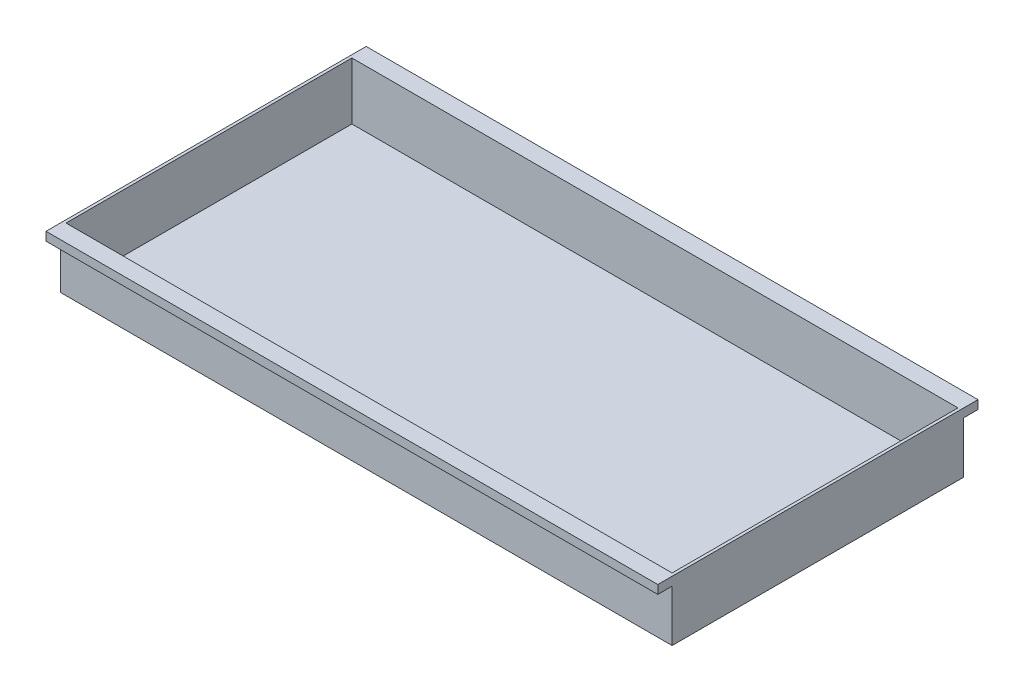
ISO-10303-21;
HEADER;
FILE_DESCRIPTION(('STEP AP214'),'2;1');
FILE_NAME('part.step','',(''),(''),'','','');
FILE_SCHEMA(('AUTOMOTIVE_DESIGN { 1 0 10303 214 1 1 1 1 }'));
ENDSEC;
DATA;
#1=APPLICATION_CONTEXT('core data for automotive mechanical design processes');
#2=APPLICATION_PROTOCOL_DEFINITION('international standard','automotive_design',2000,#1);
#3=PRODUCT_CONTEXT('',#1,'mechanical');
#4=PRODUCT('Part','Part','',(#3));
#5=PRODUCT_RELATED_PRODUCT_CATEGORY('part','',(#4));
#6=PRODUCT_DEFINITION_FORMATION('','',#4);
#7=PRODUCT_DEFINITION_CONTEXT('part definition',#1,'design');
#8=PRODUCT_DEFINITION('design','',#6,#7);
#9=PRODUCT_DEFINITION_SHAPE('','',#8);
#10=(LENGTH_UNIT() NAMED_UNIT(*) SI_UNIT(.MILLI.,.METRE.));
#11=(NAMED_UNIT(*) PLANE_ANGLE_UNIT() SI_UNIT($,.RADIAN.));
#12=(NAMED_UNIT(*) SI_UNIT($,.STERADIAN.) SOLID_ANGLE_UNIT());
#13=UNCERTAINTY_MEASURE_WITH_UNIT(LENGTH_MEASURE(1.E-05),#10,'distance_accuracy_value','');
#14=(GEOMETRIC_REPRESENTATION_CONTEXT(3) GLOBAL_UNCERTAINTY_ASSIGNED_CONTEXT((#13)) GLOBAL_UNIT_ASSIGNED_CONTEXT((#10,
#11,#12)) REPRESENTATION_CONTEXT('',''));
#15=CARTESIAN_POINT('',(0.,0.,0.));
#16=DIRECTION('',(0.,0.,1.));
#17=DIRECTION('',(1.,0.,0.));
#18=AXIS2_PLACEMENT_3D('',#15,#16,#17);
#19=CARTESIAN_POINT('',(535.,-100.,255.));
#20=DIRECTION('',(0.,0.,1.));
#21=DIRECTION('',(1.,0.,0.));
#22=AXIS2_PLACEMENT_3D('',#19,#20,#21);
#23=PLANE('',#22);
#24=DIRECTION('',(0.,1.,0.));
#25=VECTOR('',#24,1.);
#26=CARTESIAN_POINT('',(535.,-100.,255.));
#27=LINE('',#26,#25);
#28=CARTESIAN_POINT('',(535.,-105.,255.));
#29=VERTEX_POINT('',#28);
#30=CARTESIAN_POINT('',(535.,-15.,255.));
#31=VERTEX_POINT('',#30);
#32=EDGE_CURVE('E177',#29,#31,#27,.T.);
#33=ORIENTED_EDGE('',*,*,#32,.T.);
#34=DIRECTION('',(-1.,0.,0.));
#35=VECTOR('',#34,1.);
#36=CARTESIAN_POINT('',(-535.,-15.,255.));
#37=LINE('',#36,#35);
#38=CARTESIAN_POINT('',(-535.,-15.,255.));
#39=VERTEX_POINT('',#38);
#40=EDGE_CURVE('E166',#31,#39,#37,.T.);
#41=ORIENTED_EDGE('',*,*,#40,.T.);
#42=DIRECTION('',(0.,1.,0.));
#43=VECTOR('',#42,1.);
#44=CARTESIAN_POINT('',(-535.,-100.,255.));
#45=LINE('',#44,#43);
#46=CARTESIAN_POINT('',(-535.,-105.,255.));
#47=VERTEX_POINT('',#46);
#48=EDGE_CURVE('E165',#47,#39,#45,.T.);
#49=ORIENTED_EDGE('',*,*,#48,.F.);
#50=DIRECTION('',(-1.,0.,0.));
#51=VECTOR('',#50,1.);
#52=CARTESIAN_POINT('',(535.,-105.,255.));
#53=LINE('',#52,#51);
#54=EDGE_CURVE('E182',#29,#47,#53,.T.);
#55=ORIENTED_EDGE('',*,*,#54,.F.);
#56=EDGE_LOOP('',(#33,#41,#49,#55));
#57=FACE_BOUND('',#56,.T.);
#58=ADVANCED_FACE('F55',(#57),#23,.T.);
#59=CARTESIAN_POINT('',(535.,-100.,-255.));
#60=DIRECTION('',(0.,0.,-1.));
#61=DIRECTION('',(-1.,0.,0.));
#62=AXIS2_PLACEMENT_3D('',#59,#60,#61);
#63=PLANE('',#62);
#64=DIRECTION('',(0.,1.,0.));
#65=VECTOR('',#64,1.);
#66=CARTESIAN_POINT('',(-535.,-100.,-255.));
#67=LINE('',#66,#65);
#68=CARTESIAN_POINT('',(-535.,-105.,-255.));
#69=VERTEX_POINT('',#68);
#70=CARTESIAN_POINT('',(-535.,-15.,-255.));
#71=VERTEX_POINT('',#70);
#72=EDGE_CURVE('E12',#69,#71,#67,.T.);
#73=ORIENTED_EDGE('',*,*,#72,.T.);
#74=DIRECTION('',(1.,0.,0.));
#75=VECTOR('',#74,1.);
#76=CARTESIAN_POINT('',(-535.,-15.,-255.));
#77=LINE('',#76,#75);
#78=CARTESIAN_POINT('',(535.,-15.,-255.));
#79=VERTEX_POINT('',#78);
#80=EDGE_CURVE('E196',#71,#79,#77,.T.);
#81=ORIENTED_EDGE('',*,*,#80,.T.);
#82=DIRECTION('',(0.,1.,0.));
#83=VECTOR('',#82,1.);
#84=CARTESIAN_POINT('',(535.,-100.,-255.));
#85=LINE('',#84,#83);
#86=CARTESIAN_POINT('',(535.,-105.,-255.));
#87=VERTEX_POINT('',#86);
#88=EDGE_CURVE('E64',#87,#79,#85,.T.);
#89=ORIENTED_EDGE('',*,*,#88,.F.);
#90=DIRECTION('',(1.,0.,0.));
#91=VECTOR('',#90,1.);
#92=CARTESIAN_POINT('',(-535.,-105.,-255.));
#93=LINE('',#92,#91);
#94=EDGE_CURVE('E238',#69,#87,#93,.T.);
#95=ORIENTED_EDGE('',*,*,#94,.F.);
#96=EDGE_LOOP('',(#73,#81,#89,#95));
#97=FACE_BOUND('',#96,.T.);
#98=ADVANCED_FACE('F275',(#97),#63,.T.);
#99=CARTESIAN_POINT('',(-535.,-100.,255.));
#100=DIRECTION('',(-1.,0.,0.));
#101=DIRECTION('',(0.,0.,1.));
#102=AXIS2_PLACEMENT_3D('',#99,#100,#101);
#103=PLANE('',#102);
#104=DIRECTION('',(0.,0.,1.));
#105=VECTOR('',#104,1.);
#106=CARTESIAN_POINT('',(-535.,0.,255.));
#107=LINE('',#106,#105);
#108=CARTESIAN_POINT('',(-535.,0.,-280.));
#109=VERTEX_POINT('',#108);
#110=CARTESIAN_POINT('',(-535.,0.,280.));
#111=VERTEX_POINT('',#110);
#112=EDGE_CURVE('E202',#109,#111,#107,.T.);
#113=ORIENTED_EDGE('',*,*,#112,.F.);
#114=DIRECTION('',(0.,1.,0.));
#115=VECTOR('',#114,1.);
#116=CARTESIAN_POINT('',(-535.,-15.,-280.));
#117=LINE('',#116,#115);
#118=CARTESIAN_POINT('',(-535.,-15.,-280.));
#119=VERTEX_POINT('',#118);
#120=EDGE_CURVE('E245',#119,#109,#117,.T.);
#121=ORIENTED_EDGE('',*,*,#120,.F.);
#122=DIRECTION('',(0.,0.,1.));
#123=VECTOR('',#122,1.);
#124=CARTESIAN_POINT('',(-535.,-15.,-255.));
#125=LINE('',#124,#123);
#126=EDGE_CURVE('E255',#119,#71,#125,.T.);
#127=ORIENTED_EDGE('',*,*,#126,.T.);
#128=ORIENTED_EDGE('',*,*,#72,.F.);
#129=DIRECTION('',(0.,0.,-1.));
#130=VECTOR('',#129,1.);
#131=CARTESIAN_POINT('',(-535.,-105.,255.));
#132=LINE('',#131,#130);
#133=EDGE_CURVE('E241',#47,#69,#132,.T.);
#134=ORIENTED_EDGE('',*,*,#133,.F.);
#135=ORIENTED_EDGE('',*,*,#48,.T.);
#136=DIRECTION('',(0.,0.,1.));
#137=VECTOR('',#136,1.);
#138=CARTESIAN_POINT('',(-535.,-15.,255.));
#139=LINE('',#138,#137);
#140=CARTESIAN_POINT('',(-535.,-15.,280.));
#141=VERTEX_POINT('',#140);
#142=EDGE_CURVE('E72',#39,#141,#139,.T.);
#143=ORIENTED_EDGE('',*,*,#142,.T.);
#144=DIRECTION('',(0.,1.,0.));
#145=VECTOR('',#144,1.);
#146=CARTESIAN_POINT('',(-535.,-15.,280.));
#147=LINE('',#146,#145);
#148=EDGE_CURVE('E149',#141,#111,#147,.T.);
#149=ORIENTED_EDGE('',*,*,#148,.T.);
#150=EDGE_LOOP('',(#113,#121,#127,#128,#134,#135,#143,#149));
#151=FACE_BOUND('',#150,.T.);
#152=ADVANCED_FACE('F57',(#151),#103,.T.);
#153=CARTESIAN_POINT('',(535.,-100.,255.));
#154=DIRECTION('',(1.,0.,0.));
#155=DIRECTION('',(0.,0.,-1.));
#156=AXIS2_PLACEMENT_3D('',#153,#154,#155);
#157=PLANE('',#156);
#158=DIRECTION('',(0.,0.,-1.));
#159=VECTOR('',#158,1.);
#160=CARTESIAN_POINT('',(535.,0.,255.));
#161=LINE('',#160,#159);
#162=CARTESIAN_POINT('',(535.,0.,280.));
#163=VERTEX_POINT('',#162);
#164=CARTESIAN_POINT('',(535.,0.,-280.));
#165=VERTEX_POINT('',#164);
#166=EDGE_CURVE('E185',#163,#165,#161,.T.);
#167=ORIENTED_EDGE('',*,*,#166,.F.);
#168=DIRECTION('',(0.,1.,0.));
#169=VECTOR('',#168,1.);
#170=CARTESIAN_POINT('',(535.,-15.,280.));
#171=LINE('',#170,#169);
#172=CARTESIAN_POINT('',(535.,-15.,280.));
#173=VERTEX_POINT('',#172);
#174=EDGE_CURVE('E157',#173,#163,#171,.T.);
#175=ORIENTED_EDGE('',*,*,#174,.F.);
#176=DIRECTION('',(0.,0.,-1.));
#177=VECTOR('',#176,1.);
#178=CARTESIAN_POINT('',(535.,-15.,255.));
#179=LINE('',#178,#177);
#180=EDGE_CURVE('E158',#173,#31,#179,.T.);
#181=ORIENTED_EDGE('',*,*,#180,.T.);
#182=ORIENTED_EDGE('',*,*,#32,.F.);
#183=DIRECTION('',(0.,0.,1.));
#184=VECTOR('',#183,1.);
#185=CARTESIAN_POINT('',(535.,-105.,-255.));
#186=LINE('',#185,#184);
#187=EDGE_CURVE('E226',#87,#29,#186,.T.);
#188=ORIENTED_EDGE('',*,*,#187,.F.);
#189=ORIENTED_EDGE('',*,*,#88,.T.);
#190=DIRECTION('',(0.,0.,-1.));
#191=VECTOR('',#190,1.);
#192=CARTESIAN_POINT('',(535.,-15.,-255.));
#193=LINE('',#192,#191);
#194=CARTESIAN_POINT('',(535.,-15.,-280.));
#195=VERTEX_POINT('',#194);
#196=EDGE_CURVE('E80',#79,#195,#193,.T.);
#197=ORIENTED_EDGE('',*,*,#196,.T.);
#198=DIRECTION('',(0.,1.,0.));
#199=VECTOR('',#198,1.);
#200=CARTESIAN_POINT('',(535.,-15.,-280.));
#201=LINE('',#200,#199);
#202=EDGE_CURVE('E246',#195,#165,#201,.T.);
#203=ORIENTED_EDGE('',*,*,#202,.T.);
#204=EDGE_LOOP('',(#167,#175,#181,#182,#188,#189,#197,#203));
#205=FACE_BOUND('',#204,.T.);
#206=ADVANCED_FACE('F175',(#205),#157,.T.);
#207=CARTESIAN_POINT('',(-535.,0.,255.));
#208=DIRECTION('',(0.,1.,0.));
#209=DIRECTION('',(0.,0.,1.));
#210=AXIS2_PLACEMENT_3D('',#207,#208,#209);
#211=PLANE('',#210);
#212=DIRECTION('',(0.,0.,1.));
#213=VECTOR('',#212,1.);
#214=CARTESIAN_POINT('',(-530.,0.,255.));
#215=LINE('',#214,#213);
#216=CARTESIAN_POINT('',(-530.,0.,-250.));
#217=VERTEX_POINT('',#216);
#218=CARTESIAN_POINT('',(-530.,0.,250.));
#219=VERTEX_POINT('',#218);
#220=EDGE_CURVE('E224',#217,#219,#215,.T.);
#221=ORIENTED_EDGE('',*,*,#220,.F.);
#222=DIRECTION('',(-1.,0.,0.));
#223=VECTOR('',#222,1.);
#224=CARTESIAN_POINT('',(535.,0.,-250.));
#225=LINE('',#224,#223);
#226=CARTESIAN_POINT('',(530.,0.,-250.));
#227=VERTEX_POINT('',#226);
#228=EDGE_CURVE('E214',#227,#217,#225,.T.);
#229=ORIENTED_EDGE('',*,*,#228,.F.);
#230=DIRECTION('',(0.,0.,-1.));
#231=VECTOR('',#230,1.);
#232=CARTESIAN_POINT('',(530.,0.,255.));
#233=LINE('',#232,#231);
#234=CARTESIAN_POINT('',(530.,0.,250.));
#235=VERTEX_POINT('',#234);
#236=EDGE_CURVE('E218',#235,#227,#233,.T.);
#237=ORIENTED_EDGE('',*,*,#236,.F.);
#238=DIRECTION('',(1.,0.,0.));
#239=VECTOR('',#238,1.);
#240=CARTESIAN_POINT('',(535.,0.,250.));
#241=LINE('',#240,#239);
#242=EDGE_CURVE('E221',#219,#235,#241,.T.);
#243=ORIENTED_EDGE('',*,*,#242,.F.);
#244=EDGE_LOOP('',(#221,#229,#237,#243));
#245=FACE_BOUND('',#244,.T.);
#246=ORIENTED_EDGE('',*,*,#112,.T.);
#247=DIRECTION('',(1.,0.,0.));
#248=VECTOR('',#247,1.);
#249=CARTESIAN_POINT('',(-535.,0.,280.));
#250=LINE('',#249,#248);
#251=EDGE_CURVE('E155',#111,#163,#250,.T.);
#252=ORIENTED_EDGE('',*,*,#251,.T.);
#253=ORIENTED_EDGE('',*,*,#166,.T.);
#254=DIRECTION('',(-1.,0.,0.));
#255=VECTOR('',#254,1.);
#256=CARTESIAN_POINT('',(-535.,0.,-280.));
#257=LINE('',#256,#255);
#258=EDGE_CURVE('E252',#165,#109,#257,.T.);
#259=ORIENTED_EDGE('',*,*,#258,.T.);
#260=EDGE_LOOP('',(#246,#252,#253,#259));
#261=FACE_BOUND('',#260,.T.);
#262=ADVANCED_FACE('F262',(#245,#261),#211,.T.);
#263=CARTESIAN_POINT('',(-530.,-100.,255.));
#264=DIRECTION('',(-1.,0.,0.));
#265=DIRECTION('',(0.,0.,1.));
#266=AXIS2_PLACEMENT_3D('',#263,#264,#265);
#267=PLANE('',#266);
#268=ORIENTED_EDGE('',*,*,#220,.T.);
#269=DIRECTION('',(0.,1.,0.));
#270=VECTOR('',#269,1.);
#271=CARTESIAN_POINT('',(-530.,-100.,250.));
#272=LINE('',#271,#270);
#273=CARTESIAN_POINT('',(-530.,-100.,250.));
#274=VERTEX_POINT('',#273);
#275=EDGE_CURVE('E205',#274,#219,#272,.T.);
#276=ORIENTED_EDGE('',*,*,#275,.F.);
#277=DIRECTION('',(0.,0.,1.));
#278=VECTOR('',#277,1.);
#279=CARTESIAN_POINT('',(-530.,-100.,255.));
#280=LINE('',#279,#278);
#281=CARTESIAN_POINT('',(-530.,-100.,-250.));
#282=VERTEX_POINT('',#281);
#283=EDGE_CURVE('E217',#282,#274,#280,.T.);
#284=ORIENTED_EDGE('',*,*,#283,.F.);
#285=DIRECTION('',(0.,1.,0.));
#286=VECTOR('',#285,1.);
#287=CARTESIAN_POINT('',(-530.,-100.,-250.));
#288=LINE('',#287,#286);
#289=EDGE_CURVE('E204',#282,#217,#288,.T.);
#290=ORIENTED_EDGE('',*,*,#289,.T.);
#291=EDGE_LOOP('',(#268,#276,#284,#290));
#292=FACE_BOUND('',#291,.T.);
#293=ADVANCED_FACE('F299',(#292),#267,.F.);
#294=CARTESIAN_POINT('',(535.,-100.,-250.));
#295=DIRECTION('',(0.,0.,-1.));
#296=DIRECTION('',(-1.,0.,0.));
#297=AXIS2_PLACEMENT_3D('',#294,#295,#296);
#298=PLANE('',#297);
#299=ORIENTED_EDGE('',*,*,#228,.T.);
#300=ORIENTED_EDGE('',*,*,#289,.F.);
#301=DIRECTION('',(-1.,0.,0.));
#302=VECTOR('',#301,1.);
#303=CARTESIAN_POINT('',(535.,-100.,-250.));
#304=LINE('',#303,#302);
#305=CARTESIAN_POINT('',(530.,-100.,-250.));
#306=VERTEX_POINT('',#305);
#307=EDGE_CURVE('E209',#306,#282,#304,.T.);
#308=ORIENTED_EDGE('',*,*,#307,.F.);
#309=DIRECTION('',(0.,1.,0.));
#310=VECTOR('',#309,1.);
#311=CARTESIAN_POINT('',(530.,-100.,-250.));
#312=LINE('',#311,#310);
#313=EDGE_CURVE('E211',#306,#227,#312,.T.);
#314=ORIENTED_EDGE('',*,*,#313,.T.);
#315=EDGE_LOOP('',(#299,#300,#308,#314));
#316=FACE_BOUND('',#315,.T.);
#317=ADVANCED_FACE('F303',(#316),#298,.F.);
#318=CARTESIAN_POINT('',(530.,-100.,255.));
#319=DIRECTION('',(1.,0.,0.));
#320=DIRECTION('',(0.,0.,-1.));
#321=AXIS2_PLACEMENT_3D('',#318,#319,#320);
#322=PLANE('',#321);
#323=ORIENTED_EDGE('',*,*,#236,.T.);
#324=ORIENTED_EDGE('',*,*,#313,.F.);
#325=DIRECTION('',(0.,0.,-1.));
#326=VECTOR('',#325,1.);
#327=CARTESIAN_POINT('',(530.,-100.,255.));
#328=LINE('',#327,#326);
#329=CARTESIAN_POINT('',(530.,-100.,250.));
#330=VERTEX_POINT('',#329);
#331=EDGE_CURVE('E229',#330,#306,#328,.T.);
#332=ORIENTED_EDGE('',*,*,#331,.F.);
#333=DIRECTION('',(0.,1.,0.));
#334=VECTOR('',#333,1.);
#335=CARTESIAN_POINT('',(530.,-100.,250.));
#336=LINE('',#335,#334);
#337=EDGE_CURVE('E208',#330,#235,#336,.T.);
#338=ORIENTED_EDGE('',*,*,#337,.T.);
#339=EDGE_LOOP('',(#323,#324,#332,#338));
#340=FACE_BOUND('',#339,.T.);
#341=ADVANCED_FACE('F307',(#340),#322,.F.);
#342=CARTESIAN_POINT('',(535.,-100.,250.));
#343=DIRECTION('',(0.,0.,1.));
#344=DIRECTION('',(1.,0.,0.));
#345=AXIS2_PLACEMENT_3D('',#342,#343,#344);
#346=PLANE('',#345);
#347=ORIENTED_EDGE('',*,*,#242,.T.);
#348=ORIENTED_EDGE('',*,*,#337,.F.);
#349=DIRECTION('',(1.,0.,0.));
#350=VECTOR('',#349,1.);
#351=CARTESIAN_POINT('',(535.,-100.,250.));
#352=LINE('',#351,#350);
#353=EDGE_CURVE('E232',#274,#330,#352,.T.);
#354=ORIENTED_EDGE('',*,*,#353,.F.);
#355=ORIENTED_EDGE('',*,*,#275,.T.);
#356=EDGE_LOOP('',(#347,#348,#354,#355));
#357=FACE_BOUND('',#356,.T.);
#358=ADVANCED_FACE('F286',(#357),#346,.F.);
#359=CARTESIAN_POINT('',(-535.,-100.,255.));
#360=DIRECTION('',(0.,-1.,0.));
#361=DIRECTION('',(0.,0.,-1.));
#362=AXIS2_PLACEMENT_3D('',#359,#360,#361);
#363=PLANE('',#362);
#364=ORIENTED_EDGE('',*,*,#307,.T.);
#365=ORIENTED_EDGE('',*,*,#283,.T.);
#366=ORIENTED_EDGE('',*,*,#353,.T.);
#367=ORIENTED_EDGE('',*,*,#331,.T.);
#368=EDGE_LOOP('',(#364,#365,#366,#367));
#369=FACE_BOUND('',#368,.T.);
#370=ADVANCED_FACE('F279',(#369),#363,.F.);
#371=CARTESIAN_POINT('',(-535.,-105.,255.));
#372=DIRECTION('',(0.,-1.,0.));
#373=DIRECTION('',(0.,0.,-1.));
#374=AXIS2_PLACEMENT_3D('',#371,#372,#373);
#375=PLANE('',#374);
#376=ORIENTED_EDGE('',*,*,#54,.T.);
#377=ORIENTED_EDGE('',*,*,#133,.T.);
#378=ORIENTED_EDGE('',*,*,#94,.T.);
#379=ORIENTED_EDGE('',*,*,#187,.T.);
#380=EDGE_LOOP('',(#376,#377,#378,#379));
#381=FACE_BOUND('',#380,.T.);
#382=ADVANCED_FACE('F277',(#381),#375,.T.);
#383=CARTESIAN_POINT('',(-535.,-15.,-280.));
#384=DIRECTION('',(0.,0.,-1.));
#385=DIRECTION('',(-1.,0.,0.));
#386=AXIS2_PLACEMENT_3D('',#383,#384,#385);
#387=PLANE('',#386);
#388=ORIENTED_EDGE('',*,*,#258,.F.);
#389=ORIENTED_EDGE('',*,*,#202,.F.);
#390=DIRECTION('',(-1.,0.,0.));
#391=VECTOR('',#390,1.);
#392=CARTESIAN_POINT('',(-535.,-15.,-280.));
#393=LINE('',#392,#391);
#394=EDGE_CURVE('E249',#195,#119,#393,.T.);
#395=ORIENTED_EDGE('',*,*,#394,.T.);
#396=ORIENTED_EDGE('',*,*,#120,.T.);
#397=EDGE_LOOP('',(#388,#389,#395,#396));
#398=FACE_BOUND('',#397,.T.);
#399=ADVANCED_FACE('F267',(#398),#387,.T.);
#400=CARTESIAN_POINT('',(-535.,-15.,-280.));
#401=DIRECTION('',(0.,-1.,0.));
#402=DIRECTION('',(0.,0.,-1.));
#403=AXIS2_PLACEMENT_3D('',#400,#401,#402);
#404=PLANE('',#403);
#405=ORIENTED_EDGE('',*,*,#126,.F.);
#406=ORIENTED_EDGE('',*,*,#394,.F.);
#407=ORIENTED_EDGE('',*,*,#196,.F.);
#408=ORIENTED_EDGE('',*,*,#80,.F.);
#409=EDGE_LOOP('',(#405,#406,#407,#408));
#410=FACE_BOUND('',#409,.T.);
#411=ADVANCED_FACE('F268',(#410),#404,.T.);
#412=CARTESIAN_POINT('',(-535.,-15.,280.));
#413=DIRECTION('',(0.,0.,1.));
#414=DIRECTION('',(1.,0.,0.));
#415=AXIS2_PLACEMENT_3D('',#412,#413,#414);
#416=PLANE('',#415);
#417=ORIENTED_EDGE('',*,*,#251,.F.);
#418=ORIENTED_EDGE('',*,*,#148,.F.);
#419=DIRECTION('',(1.,0.,0.));
#420=VECTOR('',#419,1.);
#421=CARTESIAN_POINT('',(-535.,-15.,280.));
#422=LINE('',#421,#420);
#423=EDGE_CURVE('E152',#141,#173,#422,.T.);
#424=ORIENTED_EDGE('',*,*,#423,.T.);
#425=ORIENTED_EDGE('',*,*,#174,.T.);
#426=EDGE_LOOP('',(#417,#418,#424,#425));
#427=FACE_BOUND('',#426,.T.);
#428=ADVANCED_FACE('F150',(#427),#416,.T.);
#429=CARTESIAN_POINT('',(535.,-15.,255.));
#430=DIRECTION('',(0.,-1.,0.));
#431=DIRECTION('',(0.,0.,-1.));
#432=AXIS2_PLACEMENT_3D('',#429,#430,#431);
#433=PLANE('',#432);
#434=ORIENTED_EDGE('',*,*,#40,.F.);
#435=ORIENTED_EDGE('',*,*,#180,.F.);
#436=ORIENTED_EDGE('',*,*,#423,.F.);
#437=ORIENTED_EDGE('',*,*,#142,.F.);
#438=EDGE_LOOP('',(#434,#435,#436,#437));
#439=FACE_BOUND('',#438,.T.);
#440=ADVANCED_FACE('F160',(#439),#433,.T.);
#441=CLOSED_SHELL('',(#58,#98,#152,#206,#262,#293,#317,#341,#358,#370,#382,#399,#411,#428,#440));
#442=MANIFOLD_SOLID_BREP('B2',#441);
#443=ADVANCED_BREP_SHAPE_REPRESENTATION('',(#18,#442),#14);
#444=SHAPE_DEFINITION_REPRESENTATION(#9,#443);
ENDSEC;
END-ISO-10303-21;
